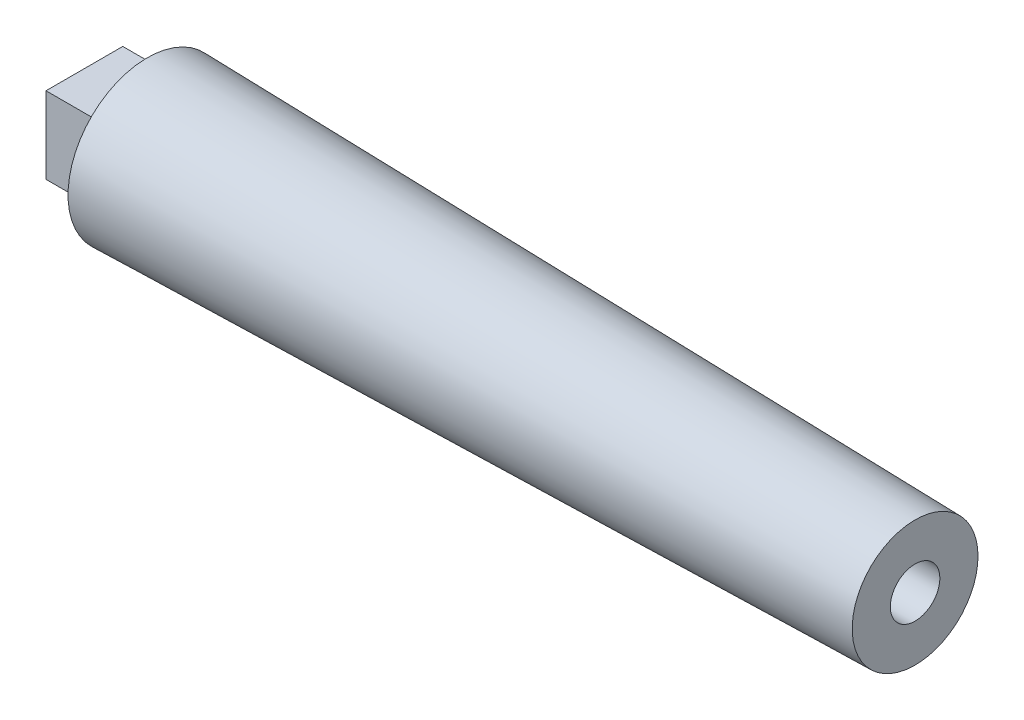
ISO-10303-21;
HEADER;
FILE_DESCRIPTION(('STEP AP214'),'2;1');
FILE_NAME('part.step','',(''),(''),'','','');
FILE_SCHEMA(('AUTOMOTIVE_DESIGN { 1 0 10303 214 1 1 1 1 }'));
ENDSEC;
DATA;
#1=APPLICATION_CONTEXT('core data for automotive mechanical design processes');
#2=APPLICATION_PROTOCOL_DEFINITION('international standard','automotive_design',2000,#1);
#3=PRODUCT_CONTEXT('',#1,'mechanical');
#4=PRODUCT('Part','Part','',(#3));
#5=PRODUCT_RELATED_PRODUCT_CATEGORY('part','',(#4));
#6=PRODUCT_DEFINITION_FORMATION('','',#4);
#7=PRODUCT_DEFINITION_CONTEXT('part definition',#1,'design');
#8=PRODUCT_DEFINITION('design','',#6,#7);
#9=PRODUCT_DEFINITION_SHAPE('','',#8);
#10=(LENGTH_UNIT() NAMED_UNIT(*) SI_UNIT(.MILLI.,.METRE.));
#11=(NAMED_UNIT(*) PLANE_ANGLE_UNIT() SI_UNIT($,.RADIAN.));
#12=(NAMED_UNIT(*) SI_UNIT($,.STERADIAN.) SOLID_ANGLE_UNIT());
#13=UNCERTAINTY_MEASURE_WITH_UNIT(LENGTH_MEASURE(1.E-05),#10,'distance_accuracy_value','');
#14=(GEOMETRIC_REPRESENTATION_CONTEXT(3) GLOBAL_UNCERTAINTY_ASSIGNED_CONTEXT((#13)) GLOBAL_UNIT_ASSIGNED_CONTEXT((#10,
#11,#12)) REPRESENTATION_CONTEXT('',''));
#15=CARTESIAN_POINT('',(0.,0.,0.));
#16=DIRECTION('',(0.,0.,1.));
#17=DIRECTION('',(1.,0.,0.));
#18=AXIS2_PLACEMENT_3D('',#15,#16,#17);
#19=CARTESIAN_POINT('',(0.,0.,0.));
#20=DIRECTION('',(-1.,0.,0.));
#21=DIRECTION('',(0.,0.,1.));
#22=AXIS2_PLACEMENT_3D('',#19,#20,#21);
#23=PLANE('',#22);
#24=DIRECTION('',(0.,1.,0.));
#25=VECTOR('',#24,1.);
#26=CARTESIAN_POINT('',(0.,7.75,7.75));
#27=LINE('',#26,#25);
#28=CARTESIAN_POINT('',(0.,-7.75,7.75));
#29=VERTEX_POINT('',#28);
#30=CARTESIAN_POINT('',(0.,7.75,7.75));
#31=VERTEX_POINT('',#30);
#32=EDGE_CURVE('E60',#29,#31,#27,.T.);
#33=ORIENTED_EDGE('',*,*,#32,.F.);
#34=DIRECTION('',(0.,0.,1.));
#35=VECTOR('',#34,1.);
#36=CARTESIAN_POINT('',(0.,-7.75,-7.75));
#37=LINE('',#36,#35);
#38=CARTESIAN_POINT('',(0.,-7.75,-7.75));
#39=VERTEX_POINT('',#38);
#40=EDGE_CURVE('E64',#39,#29,#37,.T.);
#41=ORIENTED_EDGE('',*,*,#40,.F.);
#42=DIRECTION('',(0.,-1.,0.));
#43=VECTOR('',#42,1.);
#44=CARTESIAN_POINT('',(0.,7.75,-7.75));
#45=LINE('',#44,#43);
#46=CARTESIAN_POINT('',(0.,7.75,-7.75));
#47=VERTEX_POINT('',#46);
#48=EDGE_CURVE('E124',#47,#39,#45,.T.);
#49=ORIENTED_EDGE('',*,*,#48,.F.);
#50=DIRECTION('',(0.,0.,-1.));
#51=VECTOR('',#50,1.);
#52=CARTESIAN_POINT('',(0.,7.75,-7.75));
#53=LINE('',#52,#51);
#54=EDGE_CURVE('E127',#31,#47,#53,.T.);
#55=ORIENTED_EDGE('',*,*,#54,.F.);
#56=EDGE_LOOP('',(#33,#41,#49,#55));
#57=FACE_BOUND('',#56,.T.);
#58=CARTESIAN_POINT('',(0.,0.,0.));
#59=DIRECTION('',(1.,0.,0.));
#60=DIRECTION('',(0.,0.,-1.));
#61=AXIS2_PLACEMENT_3D('',#58,#59,#60);
#62=CIRCLE('',#61,16.);
#63=CARTESIAN_POINT('',(0.,0.,-16.));
#64=VERTEX_POINT('',#63);
#65=EDGE_CURVE('E11',#64,#64,#62,.T.);
#66=ORIENTED_EDGE('',*,*,#65,.F.);
#67=EDGE_LOOP('',(#66));
#68=FACE_BOUND('',#67,.T.);
#69=ADVANCED_FACE('F45',(#57,#68),#23,.T.);
#70=CARTESIAN_POINT('',(155.,0.,0.));
#71=DIRECTION('',(-1.,0.,0.));
#72=DIRECTION('',(0.,0.,1.));
#73=AXIS2_PLACEMENT_3D('',#70,#71,#72);
#74=CONICAL_SURFACE('',#73,12.7,0.0212871066447812);
#75=ORIENTED_EDGE('',*,*,#65,.T.);
#76=EDGE_LOOP('',(#75));
#77=FACE_BOUND('',#76,.T.);
#78=CARTESIAN_POINT('',(155.,0.,0.));
#79=DIRECTION('',(1.,0.,0.));
#80=DIRECTION('',(0.,0.,-1.));
#81=AXIS2_PLACEMENT_3D('',#78,#79,#80);
#82=CIRCLE('',#81,12.7);
#83=CARTESIAN_POINT('',(155.,0.,-12.7));
#84=VERTEX_POINT('',#83);
#85=EDGE_CURVE('E53',#84,#84,#82,.T.);
#86=ORIENTED_EDGE('',*,*,#85,.F.);
#87=EDGE_LOOP('',(#86));
#88=FACE_BOUND('',#87,.T.);
#89=ADVANCED_FACE('F156',(#77,#88),#74,.T.);
#90=CARTESIAN_POINT('',(155.,12.7,0.));
#91=DIRECTION('',(1.,0.,0.));
#92=DIRECTION('',(0.,0.,-1.));
#93=AXIS2_PLACEMENT_3D('',#90,#91,#92);
#94=PLANE('',#93);
#95=CARTESIAN_POINT('',(155.,0.,0.));
#96=DIRECTION('',(1.,0.,0.));
#97=DIRECTION('',(0.,0.,-1.));
#98=AXIS2_PLACEMENT_3D('',#95,#96,#97);
#99=CIRCLE('',#98,5.);
#100=CARTESIAN_POINT('',(155.,0.,-5.));
#101=VERTEX_POINT('',#100);
#102=EDGE_CURVE('E137',#101,#101,#99,.T.);
#103=ORIENTED_EDGE('',*,*,#102,.F.);
#104=EDGE_LOOP('',(#103));
#105=FACE_BOUND('',#104,.T.);
#106=ORIENTED_EDGE('',*,*,#85,.T.);
#107=EDGE_LOOP('',(#106));
#108=FACE_BOUND('',#107,.T.);
#109=ADVANCED_FACE('F153',(#105,#108),#94,.T.);
#110=CARTESIAN_POINT('',(-12.7,7.75,7.75));
#111=DIRECTION('',(0.,0.,-1.));
#112=DIRECTION('',(0.,1.,0.));
#113=AXIS2_PLACEMENT_3D('',#110,#111,#112);
#114=PLANE('',#113);
#115=ORIENTED_EDGE('',*,*,#32,.T.);
#116=DIRECTION('',(1.,0.,0.));
#117=VECTOR('',#116,1.);
#118=CARTESIAN_POINT('',(-12.7,7.75,7.75));
#119=LINE('',#118,#117);
#120=CARTESIAN_POINT('',(-12.7,7.75,7.75));
#121=VERTEX_POINT('',#120);
#122=EDGE_CURVE('E89',#121,#31,#119,.T.);
#123=ORIENTED_EDGE('',*,*,#122,.F.);
#124=DIRECTION('',(0.,1.,0.));
#125=VECTOR('',#124,1.);
#126=CARTESIAN_POINT('',(-12.7,7.75,7.75));
#127=LINE('',#126,#125);
#128=CARTESIAN_POINT('',(-12.7,-7.75,7.75));
#129=VERTEX_POINT('',#128);
#130=EDGE_CURVE('E96',#129,#121,#127,.T.);
#131=ORIENTED_EDGE('',*,*,#130,.F.);
#132=DIRECTION('',(1.,0.,0.));
#133=VECTOR('',#132,1.);
#134=CARTESIAN_POINT('',(-12.7,-7.75,7.75));
#135=LINE('',#134,#133);
#136=EDGE_CURVE('E119',#129,#29,#135,.T.);
#137=ORIENTED_EDGE('',*,*,#136,.T.);
#138=EDGE_LOOP('',(#115,#123,#131,#137));
#139=FACE_BOUND('',#138,.T.);
#140=ADVANCED_FACE('F107',(#139),#114,.F.);
#141=CARTESIAN_POINT('',(-12.7,7.75,-7.75));
#142=DIRECTION('',(0.,-1.,0.));
#143=DIRECTION('',(0.,0.,-1.));
#144=AXIS2_PLACEMENT_3D('',#141,#142,#143);
#145=PLANE('',#144);
#146=ORIENTED_EDGE('',*,*,#54,.T.);
#147=DIRECTION('',(1.,0.,0.));
#148=VECTOR('',#147,1.);
#149=CARTESIAN_POINT('',(-12.7,7.75,-7.75));
#150=LINE('',#149,#148);
#151=CARTESIAN_POINT('',(-12.7,7.75,-7.75));
#152=VERTEX_POINT('',#151);
#153=EDGE_CURVE('E91',#152,#47,#150,.T.);
#154=ORIENTED_EDGE('',*,*,#153,.F.);
#155=DIRECTION('',(0.,0.,-1.));
#156=VECTOR('',#155,1.);
#157=CARTESIAN_POINT('',(-12.7,7.75,-7.75));
#158=LINE('',#157,#156);
#159=EDGE_CURVE('E84',#121,#152,#158,.T.);
#160=ORIENTED_EDGE('',*,*,#159,.F.);
#161=ORIENTED_EDGE('',*,*,#122,.T.);
#162=EDGE_LOOP('',(#146,#154,#160,#161));
#163=FACE_BOUND('',#162,.T.);
#164=ADVANCED_FACE('F87',(#163),#145,.F.);
#165=CARTESIAN_POINT('',(-12.7,7.75,-7.75));
#166=DIRECTION('',(0.,0.,1.));
#167=DIRECTION('',(0.,-1.,0.));
#168=AXIS2_PLACEMENT_3D('',#165,#166,#167);
#169=PLANE('',#168);
#170=ORIENTED_EDGE('',*,*,#48,.T.);
#171=DIRECTION('',(1.,0.,0.));
#172=VECTOR('',#171,1.);
#173=CARTESIAN_POINT('',(-12.7,-7.75,-7.75));
#174=LINE('',#173,#172);
#175=CARTESIAN_POINT('',(-12.7,-7.75,-7.75));
#176=VERTEX_POINT('',#175);
#177=EDGE_CURVE('E113',#176,#39,#174,.T.);
#178=ORIENTED_EDGE('',*,*,#177,.F.);
#179=DIRECTION('',(0.,-1.,0.));
#180=VECTOR('',#179,1.);
#181=CARTESIAN_POINT('',(-12.7,7.75,-7.75));
#182=LINE('',#181,#180);
#183=EDGE_CURVE('E95',#152,#176,#182,.T.);
#184=ORIENTED_EDGE('',*,*,#183,.F.);
#185=ORIENTED_EDGE('',*,*,#153,.T.);
#186=EDGE_LOOP('',(#170,#178,#184,#185));
#187=FACE_BOUND('',#186,.T.);
#188=ADVANCED_FACE('F170',(#187),#169,.F.);
#189=CARTESIAN_POINT('',(-12.7,-7.75,-7.75));
#190=DIRECTION('',(0.,1.,0.));
#191=DIRECTION('',(0.,0.,1.));
#192=AXIS2_PLACEMENT_3D('',#189,#190,#191);
#193=PLANE('',#192);
#194=ORIENTED_EDGE('',*,*,#40,.T.);
#195=ORIENTED_EDGE('',*,*,#136,.F.);
#196=DIRECTION('',(0.,0.,1.));
#197=VECTOR('',#196,1.);
#198=CARTESIAN_POINT('',(-12.7,-7.75,-7.75));
#199=LINE('',#198,#197);
#200=EDGE_CURVE('E101',#176,#129,#199,.T.);
#201=ORIENTED_EDGE('',*,*,#200,.F.);
#202=ORIENTED_EDGE('',*,*,#177,.T.);
#203=EDGE_LOOP('',(#194,#195,#201,#202));
#204=FACE_BOUND('',#203,.T.);
#205=ADVANCED_FACE('F173',(#204),#193,.F.);
#206=CARTESIAN_POINT('',(-12.7,0.,0.));
#207=DIRECTION('',(-1.,0.,0.));
#208=DIRECTION('',(0.,0.,1.));
#209=AXIS2_PLACEMENT_3D('',#206,#207,#208);
#210=PLANE('',#209);
#211=ORIENTED_EDGE('',*,*,#130,.T.);
#212=ORIENTED_EDGE('',*,*,#159,.T.);
#213=ORIENTED_EDGE('',*,*,#183,.T.);
#214=ORIENTED_EDGE('',*,*,#200,.T.);
#215=EDGE_LOOP('',(#211,#212,#213,#214));
#216=FACE_BOUND('',#215,.T.);
#217=ADVANCED_FACE('F99',(#216),#210,.T.);
#218=CARTESIAN_POINT('',(129.,0.,0.));
#219=DIRECTION('',(1.,0.,0.));
#220=DIRECTION('',(0.,0.,-1.));
#221=AXIS2_PLACEMENT_3D('',#218,#219,#220);
#222=CYLINDRICAL_SURFACE('',#221,5.);
#223=CARTESIAN_POINT('',(129.,0.,0.));
#224=DIRECTION('',(1.,0.,0.));
#225=DIRECTION('',(0.,0.,-1.));
#226=AXIS2_PLACEMENT_3D('',#223,#224,#225);
#227=CIRCLE('',#226,5.);
#228=CARTESIAN_POINT('',(129.,0.,-5.));
#229=VERTEX_POINT('',#228);
#230=EDGE_CURVE('E132',#229,#229,#227,.T.);
#231=CARTESIAN_POINT('',(129.,0.,-5.));
#232=CARTESIAN_POINT('',(129.270833333333,0.,-5.));
#233=CARTESIAN_POINT('',(129.541666666667,0.,-5.));
#234=CARTESIAN_POINT('',(130.083333333333,0.,-5.));
#235=CARTESIAN_POINT('',(130.354166666667,0.,-5.));
#236=CARTESIAN_POINT('',(130.895833333333,0.,-5.));
#237=CARTESIAN_POINT('',(131.166666666667,0.,-5.));
#238=CARTESIAN_POINT('',(131.708333333333,0.,-5.));
#239=CARTESIAN_POINT('',(131.979166666667,0.,-5.));
#240=CARTESIAN_POINT('',(132.520833333333,0.,-5.));
#241=CARTESIAN_POINT('',(132.791666666667,0.,-5.));
#242=CARTESIAN_POINT('',(133.333333333333,0.,-5.));
#243=CARTESIAN_POINT('',(133.604166666667,0.,-5.));
#244=CARTESIAN_POINT('',(134.145833333333,0.,-5.));
#245=CARTESIAN_POINT('',(134.416666666667,0.,-5.));
#246=CARTESIAN_POINT('',(134.958333333333,0.,-5.));
#247=CARTESIAN_POINT('',(135.229166666667,0.,-5.));
#248=CARTESIAN_POINT('',(135.770833333333,0.,-5.));
#249=CARTESIAN_POINT('',(136.041666666667,0.,-5.));
#250=CARTESIAN_POINT('',(136.583333333333,0.,-5.));
#251=CARTESIAN_POINT('',(136.854166666667,0.,-5.));
#252=CARTESIAN_POINT('',(137.395833333333,0.,-5.));
#253=CARTESIAN_POINT('',(137.666666666667,0.,-5.));
#254=CARTESIAN_POINT('',(138.208333333333,0.,-5.));
#255=CARTESIAN_POINT('',(138.479166666667,0.,-5.));
#256=CARTESIAN_POINT('',(139.020833333333,0.,-5.));
#257=CARTESIAN_POINT('',(139.291666666667,0.,-5.));
#258=CARTESIAN_POINT('',(139.833333333333,0.,-5.));
#259=CARTESIAN_POINT('',(140.104166666667,0.,-5.));
#260=CARTESIAN_POINT('',(140.645833333333,0.,-5.));
#261=CARTESIAN_POINT('',(140.916666666667,0.,-5.));
#262=CARTESIAN_POINT('',(141.458333333333,0.,-5.));
#263=CARTESIAN_POINT('',(141.729166666667,0.,-5.));
#264=CARTESIAN_POINT('',(142.270833333333,0.,-5.));
#265=CARTESIAN_POINT('',(142.541666666667,0.,-5.));
#266=CARTESIAN_POINT('',(143.083333333333,0.,-5.));
#267=CARTESIAN_POINT('',(143.354166666667,0.,-5.));
#268=CARTESIAN_POINT('',(143.895833333333,0.,-5.));
#269=CARTESIAN_POINT('',(144.166666666667,0.,-5.));
#270=CARTESIAN_POINT('',(144.708333333333,0.,-5.));
#271=CARTESIAN_POINT('',(144.979166666667,0.,-5.));
#272=CARTESIAN_POINT('',(145.520833333333,0.,-5.));
#273=CARTESIAN_POINT('',(145.791666666667,0.,-5.));
#274=CARTESIAN_POINT('',(146.333333333333,0.,-5.));
#275=CARTESIAN_POINT('',(146.604166666667,0.,-5.));
#276=CARTESIAN_POINT('',(147.145833333333,0.,-5.));
#277=CARTESIAN_POINT('',(147.416666666667,0.,-5.));
#278=CARTESIAN_POINT('',(147.958333333333,0.,-5.));
#279=CARTESIAN_POINT('',(148.229166666667,0.,-5.));
#280=CARTESIAN_POINT('',(148.770833333333,0.,-5.));
#281=CARTESIAN_POINT('',(149.041666666667,0.,-5.));
#282=CARTESIAN_POINT('',(149.583333333333,0.,-5.));
#283=CARTESIAN_POINT('',(149.854166666667,0.,-5.));
#284=CARTESIAN_POINT('',(150.395833333333,0.,-5.));
#285=CARTESIAN_POINT('',(150.666666666667,0.,-5.));
#286=CARTESIAN_POINT('',(151.208333333333,0.,-5.));
#287=CARTESIAN_POINT('',(151.479166666667,0.,-5.));
#288=CARTESIAN_POINT('',(152.020833333333,0.,-5.));
#289=CARTESIAN_POINT('',(152.291666666667,0.,-5.));
#290=CARTESIAN_POINT('',(152.833333333333,0.,-5.));
#291=CARTESIAN_POINT('',(153.104166666667,0.,-5.));
#292=CARTESIAN_POINT('',(153.645833333333,0.,-5.));
#293=CARTESIAN_POINT('',(153.916666666667,0.,-5.));
#294=CARTESIAN_POINT('',(154.458333333333,0.,-5.));
#295=CARTESIAN_POINT('',(154.729166666667,0.,-5.));
#296=CARTESIAN_POINT('',(155.,0.,-5.));
#297=B_SPLINE_CURVE_WITH_KNOTS('',3,(#231,#232,#233,#234,#235,#236,#237,#238,#239,#240,#241,
#242,#243,#244,#245,#246,#247,#248,#249,#250,#251,#252,#253,#254,#255,#256,#257,#258,#259,#260,
#261,#262,#263,#264,#265,#266,#267,#268,#269,#270,#271,#272,#273,#274,#275,#276,#277,#278,#279,
#280,#281,#282,#283,#284,#285,#286,#287,#288,#289,#290,#291,#292,#293,#294,#295,#296),
.UNSPECIFIED.,.F.,.F.,(4,2,2,2,2,2,2,2,2,2,2,2,2,2,2,2,2,2,2,2,2,2,2,2,2,2,2,2,2,2,2,2,4),(0.,
0.812499999999994,1.62499999999999,2.43749999999998,3.24999999999998,4.0625,4.87499999999999,
5.68749999999998,6.49999999999998,7.3125,8.12499999999999,8.93749999999999,9.74999999999998,
10.5625,11.375,12.1875,13.,13.8125,14.625,15.4375,16.25,17.0625,17.875,18.6875,19.5,20.3125,
21.125,21.9375,22.75,23.5625,24.375,25.1875,26.),.UNSPECIFIED.);
#298=EDGE_CURVE('BSEAM147',#229,#101,#297,.T.);
#299=ORIENTED_EDGE('',*,*,#230,.F.);
#300=ORIENTED_EDGE('',*,*,#102,.T.);
#301=ORIENTED_EDGE('',*,*,#298,.T.);
#302=ORIENTED_EDGE('',*,*,#298,.F.);
#303=EDGE_LOOP('',(#299,#301,#300,#302));
#304=FACE_BOUND('',#303,.T.);
#305=ADVANCED_FACE('F147',(#304),#222,.F.);
#306=CARTESIAN_POINT('',(129.,0.,0.));
#307=DIRECTION('',(1.,0.,0.));
#308=DIRECTION('',(0.,0.,-1.));
#309=AXIS2_PLACEMENT_3D('',#306,#307,#308);
#310=PLANE('',#309);
#311=ORIENTED_EDGE('',*,*,#230,.T.);
#312=EDGE_LOOP('',(#311));
#313=FACE_BOUND('',#312,.T.);
#314=ADVANCED_FACE('F145',(#313),#310,.T.);
#315=CLOSED_SHELL('',(#69,#89,#109,#140,#164,#188,#205,#217,#305,#314));
#316=MANIFOLD_SOLID_BREP('B2',#315);
#317=ADVANCED_BREP_SHAPE_REPRESENTATION('',(#18,#316),#14);
#318=SHAPE_DEFINITION_REPRESENTATION(#9,#317);
ENDSEC;
END-ISO-10303-21;
